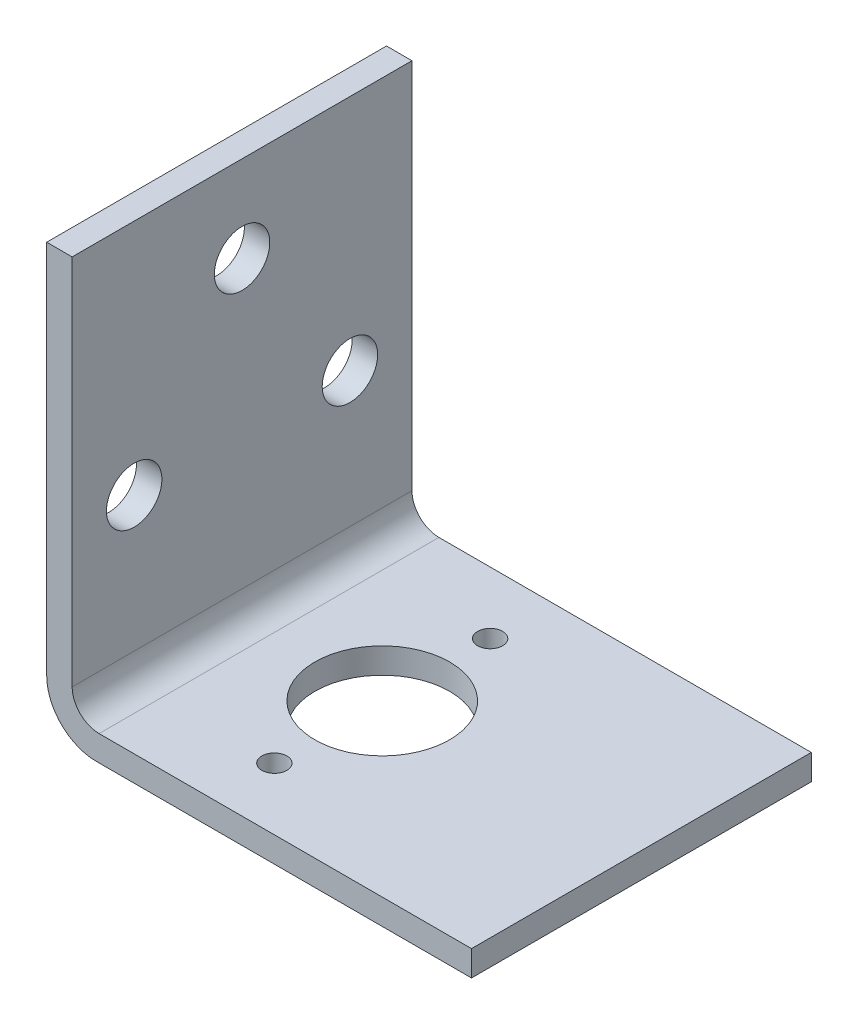
ISO-10303-21;
HEADER;
FILE_DESCRIPTION(('STEP AP214'),'2;1');
FILE_NAME('part.step','',(''),(''),'','','');
FILE_SCHEMA(('AUTOMOTIVE_DESIGN { 1 0 10303 214 1 1 1 1 }'));
ENDSEC;
DATA;
#1=APPLICATION_CONTEXT('core data for automotive mechanical design processes');
#2=APPLICATION_PROTOCOL_DEFINITION('international standard','automotive_design',2000,#1);
#3=PRODUCT_CONTEXT('',#1,'mechanical');
#4=PRODUCT('Part','Part','',(#3));
#5=PRODUCT_RELATED_PRODUCT_CATEGORY('part','',(#4));
#6=PRODUCT_DEFINITION_FORMATION('','',#4);
#7=PRODUCT_DEFINITION_CONTEXT('part definition',#1,'design');
#8=PRODUCT_DEFINITION('design','',#6,#7);
#9=PRODUCT_DEFINITION_SHAPE('','',#8);
#10=(LENGTH_UNIT() NAMED_UNIT(*) SI_UNIT(.MILLI.,.METRE.));
#11=(NAMED_UNIT(*) PLANE_ANGLE_UNIT() SI_UNIT($,.RADIAN.));
#12=(NAMED_UNIT(*) SI_UNIT($,.STERADIAN.) SOLID_ANGLE_UNIT());
#13=UNCERTAINTY_MEASURE_WITH_UNIT(LENGTH_MEASURE(1.E-05),#10,'distance_accuracy_value','');
#14=(GEOMETRIC_REPRESENTATION_CONTEXT(3) GLOBAL_UNCERTAINTY_ASSIGNED_CONTEXT((#13)) GLOBAL_UNIT_ASSIGNED_CONTEXT((#10,
#11,#12)) REPRESENTATION_CONTEXT('',''));
#15=CARTESIAN_POINT('',(0.,0.,0.));
#16=DIRECTION('',(0.,0.,1.));
#17=DIRECTION('',(1.,0.,0.));
#18=AXIS2_PLACEMENT_3D('',#15,#16,#17);
#19=CARTESIAN_POINT('',(0.,50.0126,40.005));
#20=DIRECTION('',(0.,-1.,0.));
#21=DIRECTION('',(0.,0.,-1.));
#22=AXIS2_PLACEMENT_3D('',#19,#20,#21);
#23=PLANE('',#22);
#24=DIRECTION('',(-1.,0.,0.));
#25=VECTOR('',#24,1.);
#26=CARTESIAN_POINT('',(0.,50.0126,0.));
#27=LINE('',#26,#25);
#28=CARTESIAN_POINT('',(2.9972,50.0126,0.));
#29=VERTEX_POINT('',#28);
#30=CARTESIAN_POINT('',(0.,50.0126,0.));
#31=VERTEX_POINT('',#30);
#32=EDGE_CURVE('E132',#29,#31,#27,.T.);
#33=ORIENTED_EDGE('',*,*,#32,.T.);
#34=DIRECTION('',(0.,0.,-1.));
#35=VECTOR('',#34,1.);
#36=CARTESIAN_POINT('',(0.,50.0126,40.005));
#37=LINE('',#36,#35);
#38=CARTESIAN_POINT('',(0.,50.0126,40.005));
#39=VERTEX_POINT('',#38);
#40=EDGE_CURVE('E11',#39,#31,#37,.T.);
#41=ORIENTED_EDGE('',*,*,#40,.F.);
#42=DIRECTION('',(-1.,0.,0.));
#43=VECTOR('',#42,1.);
#44=CARTESIAN_POINT('',(0.,50.0126,40.005));
#45=LINE('',#44,#43);
#46=CARTESIAN_POINT('',(2.9972,50.0126,40.005));
#47=VERTEX_POINT('',#46);
#48=EDGE_CURVE('E147',#47,#39,#45,.T.);
#49=ORIENTED_EDGE('',*,*,#48,.F.);
#50=DIRECTION('',(0.,0.,-1.));
#51=VECTOR('',#50,1.);
#52=CARTESIAN_POINT('',(2.9972,50.0126,40.005));
#53=LINE('',#52,#51);
#54=EDGE_CURVE('E128',#47,#29,#53,.T.);
#55=ORIENTED_EDGE('',*,*,#54,.T.);
#56=EDGE_LOOP('',(#33,#41,#49,#55));
#57=FACE_BOUND('',#56,.T.);
#58=ADVANCED_FACE('F34',(#57),#23,.F.);
#59=CARTESIAN_POINT('',(0.,5.84200000000004,40.005));
#60=DIRECTION('',(1.,0.,0.));
#61=DIRECTION('',(0.,0.,-1.));
#62=AXIS2_PLACEMENT_3D('',#59,#60,#61);
#63=PLANE('',#62);
#64=CARTESIAN_POINT('',(0.,22.0726,32.7025));
#65=DIRECTION('',(-1.,0.,0.));
#66=DIRECTION('',(0.,0.,1.));
#67=AXIS2_PLACEMENT_3D('',#64,#65,#66);
#68=CIRCLE('',#67,3.2639);
#69=CARTESIAN_POINT('',(0.,22.0726,35.9664));
#70=VERTEX_POINT('',#69);
#71=EDGE_CURVE('E175',#70,#70,#68,.T.);
#72=ORIENTED_EDGE('',*,*,#71,.F.);
#73=EDGE_LOOP('',(#72));
#74=FACE_BOUND('',#73,.T.);
#75=CARTESIAN_POINT('',(0.,39.8526,20.0025));
#76=DIRECTION('',(-1.,0.,0.));
#77=DIRECTION('',(0.,0.,1.));
#78=AXIS2_PLACEMENT_3D('',#75,#76,#77);
#79=CIRCLE('',#78,3.2639);
#80=CARTESIAN_POINT('',(0.,39.8526,23.2664));
#81=VERTEX_POINT('',#80);
#82=EDGE_CURVE('E180',#81,#81,#79,.T.);
#83=ORIENTED_EDGE('',*,*,#82,.F.);
#84=EDGE_LOOP('',(#83));
#85=FACE_BOUND('',#84,.T.);
#86=CARTESIAN_POINT('',(0.,22.0726,7.3025));
#87=DIRECTION('',(-1.,0.,0.));
#88=DIRECTION('',(0.,0.,1.));
#89=AXIS2_PLACEMENT_3D('',#86,#87,#88);
#90=CIRCLE('',#89,3.2639);
#91=CARTESIAN_POINT('',(0.,22.0726,10.5664));
#92=VERTEX_POINT('',#91);
#93=EDGE_CURVE('E172',#92,#92,#90,.T.);
#94=ORIENTED_EDGE('',*,*,#93,.F.);
#95=EDGE_LOOP('',(#94));
#96=FACE_BOUND('',#95,.T.);
#97=DIRECTION('',(0.,-1.,0.));
#98=VECTOR('',#97,1.);
#99=CARTESIAN_POINT('',(0.,5.84200000000004,0.));
#100=LINE('',#99,#98);
#101=CARTESIAN_POINT('',(0.,5.84200000000004,0.));
#102=VERTEX_POINT('',#101);
#103=EDGE_CURVE('E135',#31,#102,#100,.T.);
#104=ORIENTED_EDGE('',*,*,#103,.T.);
#105=DIRECTION('',(0.,0.,-1.));
#106=VECTOR('',#105,1.);
#107=CARTESIAN_POINT('',(0.,5.84200000000004,40.005));
#108=LINE('',#107,#106);
#109=CARTESIAN_POINT('',(0.,5.84200000000004,40.005));
#110=VERTEX_POINT('',#109);
#111=EDGE_CURVE('E43',#110,#102,#108,.T.);
#112=ORIENTED_EDGE('',*,*,#111,.F.);
#113=DIRECTION('',(0.,-1.,0.));
#114=VECTOR('',#113,1.);
#115=CARTESIAN_POINT('',(0.,5.84200000000004,40.005));
#116=LINE('',#115,#114);
#117=EDGE_CURVE('E95',#39,#110,#116,.T.);
#118=ORIENTED_EDGE('',*,*,#117,.F.);
#119=ORIENTED_EDGE('',*,*,#40,.T.);
#120=EDGE_LOOP('',(#104,#112,#118,#119));
#121=FACE_BOUND('',#120,.T.);
#122=ADVANCED_FACE('F231',(#74,#85,#96,#121),#63,.F.);
#123=CARTESIAN_POINT('',(5.842,5.842,40.005));
#124=DIRECTION('',(0.,0.,-1.));
#125=DIRECTION('',(-1.,0.,0.));
#126=AXIS2_PLACEMENT_3D('',#123,#124,#125);
#127=CYLINDRICAL_SURFACE('',#126,5.842);
#128=CARTESIAN_POINT('',(5.842,5.842,0.));
#129=DIRECTION('',(0.,0.,1.));
#130=DIRECTION('',(1.,0.,0.));
#131=AXIS2_PLACEMENT_3D('',#128,#129,#130);
#132=CIRCLE('',#131,5.842);
#133=CARTESIAN_POINT('',(5.84200000000004,0.,0.));
#134=VERTEX_POINT('',#133);
#135=EDGE_CURVE('E138',#102,#134,#132,.T.);
#136=ORIENTED_EDGE('',*,*,#135,.T.);
#137=DIRECTION('',(0.,0.,-1.));
#138=VECTOR('',#137,1.);
#139=CARTESIAN_POINT('',(5.84200000000004,0.,40.005));
#140=LINE('',#139,#138);
#141=CARTESIAN_POINT('',(5.84200000000004,0.,40.005));
#142=VERTEX_POINT('',#141);
#143=EDGE_CURVE('E154',#142,#134,#140,.T.);
#144=ORIENTED_EDGE('',*,*,#143,.F.);
#145=CARTESIAN_POINT('',(5.842,5.842,40.005));
#146=DIRECTION('',(0.,0.,1.));
#147=DIRECTION('',(1.,0.,0.));
#148=AXIS2_PLACEMENT_3D('',#145,#146,#147);
#149=CIRCLE('',#148,5.842);
#150=EDGE_CURVE('E197',#110,#142,#149,.T.);
#151=ORIENTED_EDGE('',*,*,#150,.F.);
#152=ORIENTED_EDGE('',*,*,#111,.T.);
#153=EDGE_LOOP('',(#136,#144,#151,#152));
#154=FACE_BOUND('',#153,.T.);
#155=ADVANCED_FACE('F235',(#154),#127,.T.);
#156=CARTESIAN_POINT('',(5.84200000000004,0.,40.005));
#157=DIRECTION('',(0.,1.,0.));
#158=DIRECTION('',(0.,0.,1.));
#159=AXIS2_PLACEMENT_3D('',#156,#157,#158);
#160=PLANE('',#159);
#161=CARTESIAN_POINT('',(19.500000116,0.,7.3025));
#162=DIRECTION('',(0.,1.,0.));
#163=DIRECTION('',(0.,0.,1.));
#164=AXIS2_PLACEMENT_3D('',#161,#162,#163);
#165=CIRCLE('',#164,1.4732);
#166=CARTESIAN_POINT('',(19.500000116,0.,8.7757));
#167=VERTEX_POINT('',#166);
#168=EDGE_CURVE('E162',#167,#167,#165,.T.);
#169=ORIENTED_EDGE('',*,*,#168,.T.);
#170=EDGE_LOOP('',(#169));
#171=FACE_BOUND('',#170,.T.);
#172=CARTESIAN_POINT('',(19.500000116,0.,20.0025));
#173=DIRECTION('',(0.,1.,0.));
#174=DIRECTION('',(0.,0.,1.));
#175=AXIS2_PLACEMENT_3D('',#172,#173,#174);
#176=CIRCLE('',#175,7.9375);
#177=CARTESIAN_POINT('',(19.500000116,0.,27.94));
#178=VERTEX_POINT('',#177);
#179=EDGE_CURVE('E166',#178,#178,#176,.T.);
#180=ORIENTED_EDGE('',*,*,#179,.T.);
#181=EDGE_LOOP('',(#180));
#182=FACE_BOUND('',#181,.T.);
#183=CARTESIAN_POINT('',(19.500000116,0.,32.7025));
#184=DIRECTION('',(0.,1.,0.));
#185=DIRECTION('',(0.,0.,1.));
#186=AXIS2_PLACEMENT_3D('',#183,#184,#185);
#187=CIRCLE('',#186,1.4732);
#188=CARTESIAN_POINT('',(19.500000116,0.,34.1757));
#189=VERTEX_POINT('',#188);
#190=EDGE_CURVE('E136',#189,#189,#187,.T.);
#191=ORIENTED_EDGE('',*,*,#190,.T.);
#192=EDGE_LOOP('',(#191));
#193=FACE_BOUND('',#192,.T.);
#194=DIRECTION('',(1.,0.,0.));
#195=VECTOR('',#194,1.);
#196=CARTESIAN_POINT('',(5.84200000000004,0.,0.));
#197=LINE('',#196,#195);
#198=CARTESIAN_POINT('',(50.0126,0.,0.));
#199=VERTEX_POINT('',#198);
#200=EDGE_CURVE('E140',#134,#199,#197,.T.);
#201=ORIENTED_EDGE('',*,*,#200,.T.);
#202=DIRECTION('',(0.,0.,-1.));
#203=VECTOR('',#202,1.);
#204=CARTESIAN_POINT('',(50.0126,0.,40.005));
#205=LINE('',#204,#203);
#206=CARTESIAN_POINT('',(50.0126,0.,40.005));
#207=VERTEX_POINT('',#206);
#208=EDGE_CURVE('E151',#207,#199,#205,.T.);
#209=ORIENTED_EDGE('',*,*,#208,.F.);
#210=DIRECTION('',(1.,0.,0.));
#211=VECTOR('',#210,1.);
#212=CARTESIAN_POINT('',(5.84200000000004,0.,40.005));
#213=LINE('',#212,#211);
#214=EDGE_CURVE('E199',#142,#207,#213,.T.);
#215=ORIENTED_EDGE('',*,*,#214,.F.);
#216=ORIENTED_EDGE('',*,*,#143,.T.);
#217=EDGE_LOOP('',(#201,#209,#215,#216));
#218=FACE_BOUND('',#217,.T.);
#219=ADVANCED_FACE('F205',(#171,#182,#193,#218),#160,.F.);
#220=CARTESIAN_POINT('',(50.0126,2.9972,40.005));
#221=DIRECTION('',(-1.,0.,0.));
#222=DIRECTION('',(0.,0.,1.));
#223=AXIS2_PLACEMENT_3D('',#220,#221,#222);
#224=PLANE('',#223);
#225=DIRECTION('',(0.,1.,0.));
#226=VECTOR('',#225,1.);
#227=CARTESIAN_POINT('',(50.0126,2.9972,0.));
#228=LINE('',#227,#226);
#229=CARTESIAN_POINT('',(50.0126,2.9972,0.));
#230=VERTEX_POINT('',#229);
#231=EDGE_CURVE('E142',#199,#230,#228,.T.);
#232=ORIENTED_EDGE('',*,*,#231,.T.);
#233=DIRECTION('',(0.,0.,-1.));
#234=VECTOR('',#233,1.);
#235=CARTESIAN_POINT('',(50.0126,2.9972,40.005));
#236=LINE('',#235,#234);
#237=CARTESIAN_POINT('',(50.0126,2.9972,40.005));
#238=VERTEX_POINT('',#237);
#239=EDGE_CURVE('E123',#238,#230,#236,.T.);
#240=ORIENTED_EDGE('',*,*,#239,.F.);
#241=DIRECTION('',(0.,1.,0.));
#242=VECTOR('',#241,1.);
#243=CARTESIAN_POINT('',(50.0126,2.9972,40.005));
#244=LINE('',#243,#242);
#245=EDGE_CURVE('E114',#207,#238,#244,.T.);
#246=ORIENTED_EDGE('',*,*,#245,.F.);
#247=ORIENTED_EDGE('',*,*,#208,.T.);
#248=EDGE_LOOP('',(#232,#240,#246,#247));
#249=FACE_BOUND('',#248,.T.);
#250=ADVANCED_FACE('F209',(#249),#224,.F.);
#251=CARTESIAN_POINT('',(6.1722,2.9972,40.005));
#252=DIRECTION('',(0.,-1.,0.));
#253=DIRECTION('',(0.,0.,-1.));
#254=AXIS2_PLACEMENT_3D('',#251,#252,#253);
#255=PLANE('',#254);
#256=CARTESIAN_POINT('',(19.500000116,2.9972,7.3025));
#257=DIRECTION('',(0.,-1.,0.));
#258=DIRECTION('',(0.,0.,-1.));
#259=AXIS2_PLACEMENT_3D('',#256,#257,#258);
#260=CIRCLE('',#259,1.4732);
#261=CARTESIAN_POINT('',(19.500000116,2.9972,5.8293));
#262=VERTEX_POINT('',#261);
#263=EDGE_CURVE('E168',#262,#262,#260,.T.);
#264=ORIENTED_EDGE('',*,*,#263,.T.);
#265=EDGE_LOOP('',(#264));
#266=FACE_BOUND('',#265,.T.);
#267=CARTESIAN_POINT('',(19.500000116,2.9972,20.0025));
#268=DIRECTION('',(0.,-1.,0.));
#269=DIRECTION('',(0.,0.,-1.));
#270=AXIS2_PLACEMENT_3D('',#267,#268,#269);
#271=CIRCLE('',#270,7.9375);
#272=CARTESIAN_POINT('',(19.500000116,2.9972,12.065));
#273=VERTEX_POINT('',#272);
#274=EDGE_CURVE('E163',#273,#273,#271,.T.);
#275=ORIENTED_EDGE('',*,*,#274,.T.);
#276=EDGE_LOOP('',(#275));
#277=FACE_BOUND('',#276,.T.);
#278=CARTESIAN_POINT('',(19.500000116,2.9972,32.7025));
#279=DIRECTION('',(0.,-1.,0.));
#280=DIRECTION('',(0.,0.,-1.));
#281=AXIS2_PLACEMENT_3D('',#278,#279,#280);
#282=CIRCLE('',#281,1.4732);
#283=CARTESIAN_POINT('',(19.500000116,2.9972,31.2293));
#284=VERTEX_POINT('',#283);
#285=EDGE_CURVE('E159',#284,#284,#282,.T.);
#286=ORIENTED_EDGE('',*,*,#285,.T.);
#287=EDGE_LOOP('',(#286));
#288=FACE_BOUND('',#287,.T.);
#289=DIRECTION('',(-1.,0.,0.));
#290=VECTOR('',#289,1.);
#291=CARTESIAN_POINT('',(6.1722,2.9972,0.));
#292=LINE('',#291,#290);
#293=CARTESIAN_POINT('',(6.1722,2.9972,0.));
#294=VERTEX_POINT('',#293);
#295=EDGE_CURVE('E122',#230,#294,#292,.T.);
#296=ORIENTED_EDGE('',*,*,#295,.T.);
#297=DIRECTION('',(0.,0.,-1.));
#298=VECTOR('',#297,1.);
#299=CARTESIAN_POINT('',(6.1722,2.9972,40.005));
#300=LINE('',#299,#298);
#301=CARTESIAN_POINT('',(6.1722,2.9972,40.005));
#302=VERTEX_POINT('',#301);
#303=EDGE_CURVE('E119',#302,#294,#300,.T.);
#304=ORIENTED_EDGE('',*,*,#303,.F.);
#305=DIRECTION('',(-1.,0.,0.));
#306=VECTOR('',#305,1.);
#307=CARTESIAN_POINT('',(6.1722,2.9972,40.005));
#308=LINE('',#307,#306);
#309=EDGE_CURVE('E108',#238,#302,#308,.T.);
#310=ORIENTED_EDGE('',*,*,#309,.F.);
#311=ORIENTED_EDGE('',*,*,#239,.T.);
#312=EDGE_LOOP('',(#296,#304,#310,#311));
#313=FACE_BOUND('',#312,.T.);
#314=ADVANCED_FACE('F120',(#266,#277,#288,#313),#255,.F.);
#315=CARTESIAN_POINT('',(6.1722,6.1722,40.005));
#316=DIRECTION('',(0.,0.,-1.));
#317=DIRECTION('',(-1.,0.,0.));
#318=AXIS2_PLACEMENT_3D('',#315,#316,#317);
#319=CYLINDRICAL_SURFACE('',#318,3.175);
#320=CARTESIAN_POINT('',(6.1722,6.1722,0.));
#321=DIRECTION('',(0.,0.,-1.));
#322=DIRECTION('',(-1.,0.,0.));
#323=AXIS2_PLACEMENT_3D('',#320,#321,#322);
#324=CIRCLE('',#323,3.175);
#325=CARTESIAN_POINT('',(2.9972,6.1722,0.));
#326=VERTEX_POINT('',#325);
#327=EDGE_CURVE('E81',#294,#326,#324,.T.);
#328=ORIENTED_EDGE('',*,*,#327,.T.);
#329=DIRECTION('',(0.,0.,-1.));
#330=VECTOR('',#329,1.);
#331=CARTESIAN_POINT('',(2.9972,6.1722,40.005));
#332=LINE('',#331,#330);
#333=CARTESIAN_POINT('',(2.9972,6.1722,40.005));
#334=VERTEX_POINT('',#333);
#335=EDGE_CURVE('E124',#334,#326,#332,.T.);
#336=ORIENTED_EDGE('',*,*,#335,.F.);
#337=CARTESIAN_POINT('',(6.1722,6.1722,40.005));
#338=DIRECTION('',(0.,0.,-1.));
#339=DIRECTION('',(-1.,0.,0.));
#340=AXIS2_PLACEMENT_3D('',#337,#338,#339);
#341=CIRCLE('',#340,3.175);
#342=EDGE_CURVE('E112',#302,#334,#341,.T.);
#343=ORIENTED_EDGE('',*,*,#342,.F.);
#344=ORIENTED_EDGE('',*,*,#303,.T.);
#345=EDGE_LOOP('',(#328,#336,#343,#344));
#346=FACE_BOUND('',#345,.T.);
#347=ADVANCED_FACE('F126',(#346),#319,.F.);
#348=CARTESIAN_POINT('',(2.9972,6.1722,40.005));
#349=DIRECTION('',(-1.,0.,0.));
#350=DIRECTION('',(0.,0.,1.));
#351=AXIS2_PLACEMENT_3D('',#348,#349,#350);
#352=PLANE('',#351);
#353=CARTESIAN_POINT('',(2.9972,22.0726,32.7025));
#354=DIRECTION('',(-1.,0.,0.));
#355=DIRECTION('',(0.,0.,1.));
#356=AXIS2_PLACEMENT_3D('',#353,#354,#355);
#357=CIRCLE('',#356,3.2639);
#358=CARTESIAN_POINT('',(2.9972,22.0726,35.9664));
#359=VERTEX_POINT('',#358);
#360=EDGE_CURVE('E37',#359,#359,#357,.T.);
#361=ORIENTED_EDGE('',*,*,#360,.T.);
#362=EDGE_LOOP('',(#361));
#363=FACE_BOUND('',#362,.T.);
#364=CARTESIAN_POINT('',(2.9972,39.8526,20.0025));
#365=DIRECTION('',(-1.,0.,0.));
#366=DIRECTION('',(0.,0.,1.));
#367=AXIS2_PLACEMENT_3D('',#364,#365,#366);
#368=CIRCLE('',#367,3.2639);
#369=CARTESIAN_POINT('',(2.9972,39.8526,23.2664));
#370=VERTEX_POINT('',#369);
#371=EDGE_CURVE('E173',#370,#370,#368,.T.);
#372=ORIENTED_EDGE('',*,*,#371,.T.);
#373=EDGE_LOOP('',(#372));
#374=FACE_BOUND('',#373,.T.);
#375=CARTESIAN_POINT('',(2.9972,22.0726,7.3025));
#376=DIRECTION('',(-1.,0.,0.));
#377=DIRECTION('',(0.,0.,1.));
#378=AXIS2_PLACEMENT_3D('',#375,#376,#377);
#379=CIRCLE('',#378,3.2639);
#380=CARTESIAN_POINT('',(2.9972,22.0726,10.5664));
#381=VERTEX_POINT('',#380);
#382=EDGE_CURVE('E167',#381,#381,#379,.T.);
#383=ORIENTED_EDGE('',*,*,#382,.T.);
#384=EDGE_LOOP('',(#383));
#385=FACE_BOUND('',#384,.T.);
#386=DIRECTION('',(0.,1.,0.));
#387=VECTOR('',#386,1.);
#388=CARTESIAN_POINT('',(2.9972,6.1722,0.));
#389=LINE('',#388,#387);
#390=EDGE_CURVE('E87',#326,#29,#389,.T.);
#391=ORIENTED_EDGE('',*,*,#390,.T.);
#392=ORIENTED_EDGE('',*,*,#54,.F.);
#393=DIRECTION('',(0.,1.,0.));
#394=VECTOR('',#393,1.);
#395=CARTESIAN_POINT('',(2.9972,6.1722,40.005));
#396=LINE('',#395,#394);
#397=EDGE_CURVE('E52',#334,#47,#396,.T.);
#398=ORIENTED_EDGE('',*,*,#397,.F.);
#399=ORIENTED_EDGE('',*,*,#335,.T.);
#400=EDGE_LOOP('',(#391,#392,#398,#399));
#401=FACE_BOUND('',#400,.T.);
#402=ADVANCED_FACE('F217',(#363,#374,#385,#401),#352,.F.);
#403=CARTESIAN_POINT('',(6.1722,6.1722,40.005));
#404=DIRECTION('',(0.,0.,-1.));
#405=DIRECTION('',(-1.,0.,0.));
#406=AXIS2_PLACEMENT_3D('',#403,#404,#405);
#407=PLANE('',#406);
#408=ORIENTED_EDGE('',*,*,#48,.T.);
#409=ORIENTED_EDGE('',*,*,#117,.T.);
#410=ORIENTED_EDGE('',*,*,#150,.T.);
#411=ORIENTED_EDGE('',*,*,#214,.T.);
#412=ORIENTED_EDGE('',*,*,#245,.T.);
#413=ORIENTED_EDGE('',*,*,#309,.T.);
#414=ORIENTED_EDGE('',*,*,#342,.T.);
#415=ORIENTED_EDGE('',*,*,#397,.T.);
#416=EDGE_LOOP('',(#408,#409,#410,#411,#412,#413,#414,#415));
#417=FACE_BOUND('',#416,.T.);
#418=ADVANCED_FACE('F110',(#417),#407,.F.);
#419=CARTESIAN_POINT('',(6.1722,6.1722,0.));
#420=DIRECTION('',(0.,0.,-1.));
#421=DIRECTION('',(-1.,0.,0.));
#422=AXIS2_PLACEMENT_3D('',#419,#420,#421);
#423=PLANE('',#422);
#424=ORIENTED_EDGE('',*,*,#32,.F.);
#425=ORIENTED_EDGE('',*,*,#390,.F.);
#426=ORIENTED_EDGE('',*,*,#327,.F.);
#427=ORIENTED_EDGE('',*,*,#295,.F.);
#428=ORIENTED_EDGE('',*,*,#231,.F.);
#429=ORIENTED_EDGE('',*,*,#200,.F.);
#430=ORIENTED_EDGE('',*,*,#135,.F.);
#431=ORIENTED_EDGE('',*,*,#103,.F.);
#432=EDGE_LOOP('',(#424,#425,#426,#427,#428,#429,#430,#431));
#433=FACE_BOUND('',#432,.T.);
#434=ADVANCED_FACE('F212',(#433),#423,.T.);
#435=CARTESIAN_POINT('',(19.500000116,50.0126,32.7025));
#436=DIRECTION('',(0.,-1.,0.));
#437=DIRECTION('',(0.,0.,-1.));
#438=AXIS2_PLACEMENT_3D('',#435,#436,#437);
#439=CYLINDRICAL_SURFACE('',#438,1.4732);
#440=ORIENTED_EDGE('',*,*,#285,.F.);
#441=EDGE_LOOP('',(#440));
#442=FACE_BOUND('',#441,.T.);
#443=ORIENTED_EDGE('',*,*,#190,.F.);
#444=EDGE_LOOP('',(#443));
#445=FACE_BOUND('',#444,.T.);
#446=ADVANCED_FACE('F260',(#442,#445),#439,.F.);
#447=CARTESIAN_POINT('',(19.500000116,50.0126,20.0025));
#448=DIRECTION('',(0.,-1.,0.));
#449=DIRECTION('',(0.,0.,-1.));
#450=AXIS2_PLACEMENT_3D('',#447,#448,#449);
#451=CYLINDRICAL_SURFACE('',#450,7.9375);
#452=ORIENTED_EDGE('',*,*,#274,.F.);
#453=EDGE_LOOP('',(#452));
#454=FACE_BOUND('',#453,.T.);
#455=ORIENTED_EDGE('',*,*,#179,.F.);
#456=EDGE_LOOP('',(#455));
#457=FACE_BOUND('',#456,.T.);
#458=ADVANCED_FACE('F263',(#454,#457),#451,.F.);
#459=CARTESIAN_POINT('',(19.500000116,50.0126,7.3025));
#460=DIRECTION('',(0.,-1.,0.));
#461=DIRECTION('',(0.,0.,-1.));
#462=AXIS2_PLACEMENT_3D('',#459,#460,#461);
#463=CYLINDRICAL_SURFACE('',#462,1.4732);
#464=ORIENTED_EDGE('',*,*,#263,.F.);
#465=EDGE_LOOP('',(#464));
#466=FACE_BOUND('',#465,.T.);
#467=ORIENTED_EDGE('',*,*,#168,.F.);
#468=EDGE_LOOP('',(#467));
#469=FACE_BOUND('',#468,.T.);
#470=ADVANCED_FACE('F270',(#466,#469),#463,.F.);
#471=CARTESIAN_POINT('',(50.0126,22.0726,7.3025));
#472=DIRECTION('',(-1.,0.,0.));
#473=DIRECTION('',(0.,0.,1.));
#474=AXIS2_PLACEMENT_3D('',#471,#472,#473);
#475=CYLINDRICAL_SURFACE('',#474,3.2639);
#476=ORIENTED_EDGE('',*,*,#93,.T.);
#477=EDGE_LOOP('',(#476));
#478=FACE_BOUND('',#477,.T.);
#479=ORIENTED_EDGE('',*,*,#382,.F.);
#480=EDGE_LOOP('',(#479));
#481=FACE_BOUND('',#480,.T.);
#482=ADVANCED_FACE('F276',(#478,#481),#475,.F.);
#483=CARTESIAN_POINT('',(50.0126,39.8526,20.0025));
#484=DIRECTION('',(-1.,0.,0.));
#485=DIRECTION('',(0.,0.,1.));
#486=AXIS2_PLACEMENT_3D('',#483,#484,#485);
#487=CYLINDRICAL_SURFACE('',#486,3.2639);
#488=ORIENTED_EDGE('',*,*,#82,.T.);
#489=EDGE_LOOP('',(#488));
#490=FACE_BOUND('',#489,.T.);
#491=ORIENTED_EDGE('',*,*,#371,.F.);
#492=EDGE_LOOP('',(#491));
#493=FACE_BOUND('',#492,.T.);
#494=ADVANCED_FACE('F280',(#490,#493),#487,.F.);
#495=CARTESIAN_POINT('',(50.0126,22.0726,32.7025));
#496=DIRECTION('',(-1.,0.,0.));
#497=DIRECTION('',(0.,0.,1.));
#498=AXIS2_PLACEMENT_3D('',#495,#496,#497);
#499=CYLINDRICAL_SURFACE('',#498,3.2639);
#500=ORIENTED_EDGE('',*,*,#71,.T.);
#501=EDGE_LOOP('',(#500));
#502=FACE_BOUND('',#501,.T.);
#503=ORIENTED_EDGE('',*,*,#360,.F.);
#504=EDGE_LOOP('',(#503));
#505=FACE_BOUND('',#504,.T.);
#506=ADVANCED_FACE('F284',(#502,#505),#499,.F.);
#507=CLOSED_SHELL('',(#58,#122,#155,#219,#250,#314,#347,#402,#418,#434,#446,#458,#470,#482,#494,#506));
#508=MANIFOLD_SOLID_BREP('B2',#507);
#509=ADVANCED_BREP_SHAPE_REPRESENTATION('',(#18,#508),#14);
#510=SHAPE_DEFINITION_REPRESENTATION(#9,#509);
ENDSEC;
END-ISO-10303-21;
